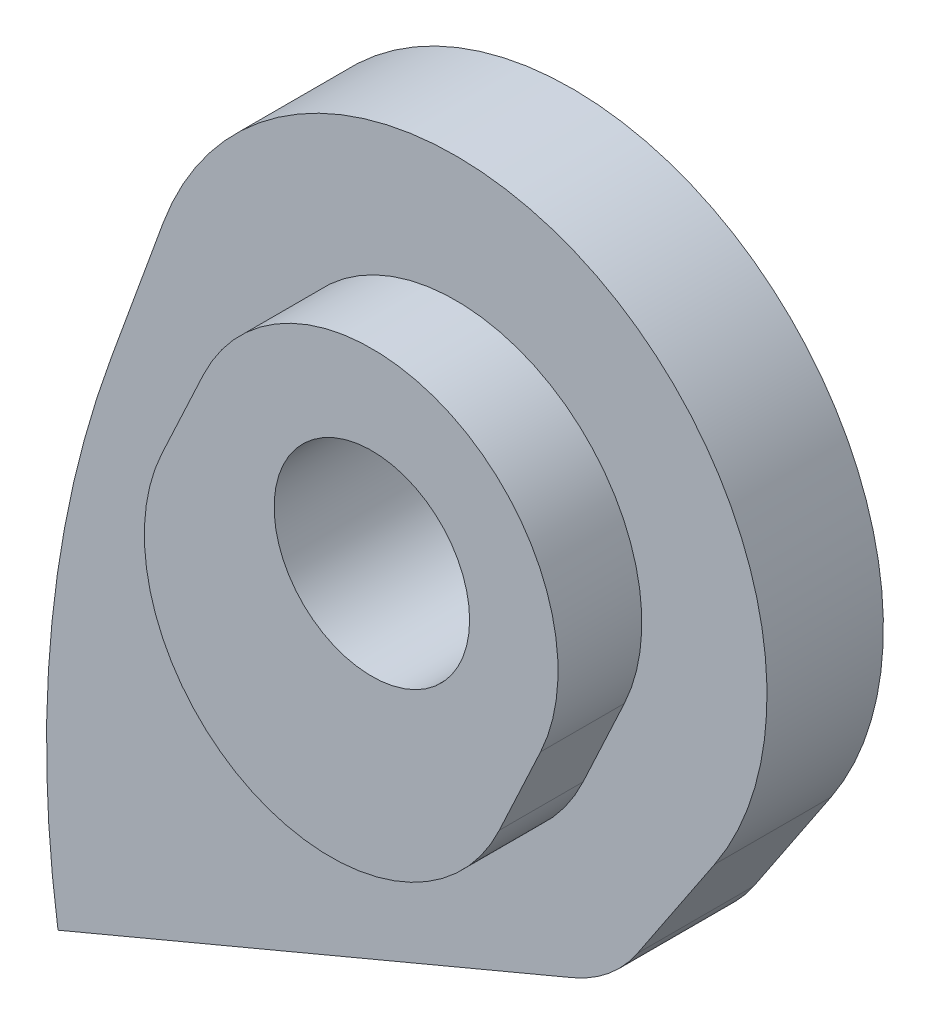
ISO-10303-21;
HEADER;
FILE_DESCRIPTION(('STEP AP214'),'2;1');
FILE_NAME('part.step','',(''),(''),'','','');
FILE_SCHEMA(('AUTOMOTIVE_DESIGN { 1 0 10303 214 1 1 1 1 }'));
ENDSEC;
DATA;
#1=APPLICATION_CONTEXT('core data for automotive mechanical design processes');
#2=APPLICATION_PROTOCOL_DEFINITION('international standard','automotive_design',2000,#1);
#3=PRODUCT_CONTEXT('',#1,'mechanical');
#4=PRODUCT('Part','Part','',(#3));
#5=PRODUCT_RELATED_PRODUCT_CATEGORY('part','',(#4));
#6=PRODUCT_DEFINITION_FORMATION('','',#4);
#7=PRODUCT_DEFINITION_CONTEXT('part definition',#1,'design');
#8=PRODUCT_DEFINITION('design','',#6,#7);
#9=PRODUCT_DEFINITION_SHAPE('','',#8);
#10=(LENGTH_UNIT() NAMED_UNIT(*) SI_UNIT(.MILLI.,.METRE.));
#11=(NAMED_UNIT(*) PLANE_ANGLE_UNIT() SI_UNIT($,.RADIAN.));
#12=(NAMED_UNIT(*) SI_UNIT($,.STERADIAN.) SOLID_ANGLE_UNIT());
#13=UNCERTAINTY_MEASURE_WITH_UNIT(LENGTH_MEASURE(1.E-05),#10,'distance_accuracy_value','');
#14=(GEOMETRIC_REPRESENTATION_CONTEXT(3) GLOBAL_UNCERTAINTY_ASSIGNED_CONTEXT((#13)) GLOBAL_UNIT_ASSIGNED_CONTEXT((#10,
#11,#12)) REPRESENTATION_CONTEXT('',''));
#15=CARTESIAN_POINT('',(0.,0.,0.));
#16=DIRECTION('',(0.,0.,1.));
#17=DIRECTION('',(1.,0.,0.));
#18=AXIS2_PLACEMENT_3D('',#15,#16,#17);
#19=CARTESIAN_POINT('',(0.11468761398859,80.1325343968941,0.));
#20=DIRECTION('',(0.,0.,1.));
#21=DIRECTION('',(1.,0.,0.));
#22=AXIS2_PLACEMENT_3D('',#19,#20,#21);
#23=PLANE('',#22);
#24=CARTESIAN_POINT('',(14.2795120747355,71.4970986035797,0.));
#25=DIRECTION('',(0.,0.,1.));
#26=DIRECTION('',(1.,0.,0.));
#27=AXIS2_PLACEMENT_3D('',#24,#25,#26);
#28=CIRCLE('',#27,22.9540740082007);
#29=CARTESIAN_POINT('',(-7.29026188774433,79.3478542857725,0.));
#30=VERTEX_POINT('',#29);
#31=CARTESIAN_POINT('',(-8.42769677737512,68.1396919078421,0.));
#32=VERTEX_POINT('',#31);
#33=EDGE_CURVE('E154',#30,#32,#28,.T.);
#34=ORIENTED_EDGE('',*,*,#33,.T.);
#35=DIRECTION('',(-0.921960246209325,-0.387284526426812,0.));
#36=VECTOR('',#35,1.);
#37=CARTESIAN_POINT('',(2.62584420432856,72.7829131335289,0.));
#38=LINE('',#37,#36);
#39=CARTESIAN_POINT('',(2.62584420432857,72.7829131335288,0.));
#40=VERTEX_POINT('',#39);
#41=EDGE_CURVE('E178',#40,#32,#38,.T.);
#42=ORIENTED_EDGE('',*,*,#41,.F.);
#43=CARTESIAN_POINT('',(1.41064938117233,75.6757767567832,0.));
#44=DIRECTION('',(0.,0.,-1.));
#45=DIRECTION('',(-1.,0.,0.));
#46=AXIS2_PLACEMENT_3D('',#43,#44,#45);
#47=CIRCLE('',#46,3.13773140994799);
#48=CARTESIAN_POINT('',(4.02035151590427,73.933705240183,0.));
#49=VERTEX_POINT('',#48);
#50=EDGE_CURVE('E173',#49,#40,#47,.T.);
#51=ORIENTED_EDGE('',*,*,#50,.F.);
#52=DIRECTION('',(0.555200968150768,0.831716228628761,0.));
#53=VECTOR('',#52,1.);
#54=CARTESIAN_POINT('',(4.02035151590429,73.933705240183,0.));
#55=LINE('',#54,#53);
#56=CARTESIAN_POINT('',(5.67886918351501,76.4182399199654,0.));
#57=VERTEX_POINT('',#56);
#58=EDGE_CURVE('E147',#49,#57,#55,.T.);
#59=ORIENTED_EDGE('',*,*,#58,.T.);
#60=CARTESIAN_POINT('',(0.11468761398859,80.1325343968941,0.));
#61=DIRECTION('',(0.,0.,1.));
#62=DIRECTION('',(1.,0.,0.));
#63=AXIS2_PLACEMENT_3D('',#60,#61,#62);
#64=CIRCLE('',#63,6.69000000000006);
#65=CARTESIAN_POINT('',(-6.17185601906935,82.4206491557424,0.));
#66=VERTEX_POINT('',#65);
#67=EDGE_CURVE('E149',#57,#66,#64,.T.);
#68=ORIENTED_EDGE('',*,*,#67,.T.);
#69=DIRECTION('',(-0.342020143325666,-0.939692620785909,0.));
#70=VECTOR('',#69,1.);
#71=CARTESIAN_POINT('',(-6.1718560190694,82.4206491557424,0.));
#72=LINE('',#71,#70);
#73=EDGE_CURVE('E155',#66,#30,#72,.T.);
#74=ORIENTED_EDGE('',*,*,#73,.T.);
#75=EDGE_LOOP('',(#34,#42,#51,#59,#68,#74));
#76=FACE_BOUND('',#75,.T.);
#77=DIRECTION('',(-0.4226182617407,-0.90630778703665,0.));
#78=VECTOR('',#77,1.);
#79=CARTESIAN_POINT('',(-3.51054353415801,81.8230074438569,0.));
#80=LINE('',#79,#78);
#81=CARTESIAN_POINT('',(-3.51054353415801,81.8230074438569,0.));
#82=VERTEX_POINT('',#81);
#83=CARTESIAN_POINT('',(-4.39804188381347,79.9197610910799,0.));
#84=VERTEX_POINT('',#83);
#85=EDGE_CURVE('E241',#82,#84,#80,.T.);
#86=ORIENTED_EDGE('',*,*,#85,.F.);
#87=CARTESIAN_POINT('',(0.114687613988609,80.1325343968941,0.));
#88=DIRECTION('',(0.,0.,1.));
#89=DIRECTION('',(1.,0.,0.));
#90=AXIS2_PLACEMENT_3D('',#87,#88,#89);
#91=CIRCLE('',#90,4.00000000000001);
#92=CARTESIAN_POINT('',(3.73991876213519,78.4420613499313,0.));
#93=VERTEX_POINT('',#92);
#94=EDGE_CURVE('E145',#93,#82,#91,.T.);
#95=ORIENTED_EDGE('',*,*,#94,.F.);
#96=DIRECTION('',(0.4226182617407,0.90630778703665,0.));
#97=VECTOR('',#96,1.);
#98=CARTESIAN_POINT('',(3.73991876213519,78.4420613499313,0.));
#99=LINE('',#98,#97);
#100=CARTESIAN_POINT('',(2.85242041247973,76.5388149971543,0.));
#101=VERTEX_POINT('',#100);
#102=EDGE_CURVE('E141',#101,#93,#99,.T.);
#103=ORIENTED_EDGE('',*,*,#102,.F.);
#104=CARTESIAN_POINT('',(-0.772810735666862,78.2292880441171,0.));
#105=DIRECTION('',(0.,0.,1.));
#106=DIRECTION('',(1.,0.,0.));
#107=AXIS2_PLACEMENT_3D('',#104,#105,#106);
#108=CIRCLE('',#107,4.00000000000001);
#109=EDGE_CURVE('E243',#84,#101,#108,.T.);
#110=ORIENTED_EDGE('',*,*,#109,.F.);
#111=EDGE_LOOP('',(#86,#95,#103,#110));
#112=FACE_BOUND('',#111,.T.);
#113=ADVANCED_FACE('F33',(#76,#112),#23,.T.);
#114=CARTESIAN_POINT('',(-8.01359795678153,76.9658058271043,-5.5));
#115=DIRECTION('',(-0.921960246209324,-0.387284526426815,0.));
#116=DIRECTION('',(0.387284526426815,-0.921960246209324,0.));
#117=AXIS2_PLACEMENT_3D('',#114,#115,#116);
#118=PLANE('',#117);
#119=DIRECTION('',(0.387284526426815,-0.921960246209324,0.));
#120=VECTOR('',#119,1.);
#121=CARTESIAN_POINT('',(-8.01359795678153,76.9658058271043,-2.5));
#122=LINE('',#121,#120);
#123=CARTESIAN_POINT('',(-8.01359795678153,76.9658058271043,-2.5));
#124=VERTEX_POINT('',#123);
#125=CARTESIAN_POINT('',(-4.92424784177968,69.611373108264,-2.5));
#126=VERTEX_POINT('',#125);
#127=EDGE_CURVE('E56',#124,#126,#122,.T.);
#128=ORIENTED_EDGE('',*,*,#127,.T.);
#129=DIRECTION('',(0.,0.,1.));
#130=VECTOR('',#129,1.);
#131=CARTESIAN_POINT('',(-4.92424784177968,69.611373108264,-5.5));
#132=LINE('',#131,#130);
#133=CARTESIAN_POINT('',(-4.92424784177968,69.611373108264,-5.5));
#134=VERTEX_POINT('',#133);
#135=EDGE_CURVE('E166',#134,#126,#132,.T.);
#136=ORIENTED_EDGE('',*,*,#135,.F.);
#137=DIRECTION('',(0.387284526426815,-0.921960246209324,0.));
#138=VECTOR('',#137,1.);
#139=CARTESIAN_POINT('',(-8.01359795678153,76.9658058271043,-5.5));
#140=LINE('',#139,#138);
#141=CARTESIAN_POINT('',(-8.01359795678153,76.9658058271043,-5.5));
#142=VERTEX_POINT('',#141);
#143=EDGE_CURVE('E164',#142,#134,#140,.T.);
#144=ORIENTED_EDGE('',*,*,#143,.F.);
#145=DIRECTION('',(0.,0.,1.));
#146=VECTOR('',#145,1.);
#147=CARTESIAN_POINT('',(-8.01359795678153,76.9658058271043,-5.5));
#148=LINE('',#147,#146);
#149=EDGE_CURVE('E170',#142,#124,#148,.T.);
#150=ORIENTED_EDGE('',*,*,#149,.T.);
#151=EDGE_LOOP('',(#128,#136,#144,#150));
#152=FACE_BOUND('',#151,.T.);
#153=ADVANCED_FACE('F230',(#152),#118,.F.);
#154=CARTESIAN_POINT('',(14.2795120747355,71.4970986035797,-5.5));
#155=DIRECTION('',(0.,0.,1.));
#156=DIRECTION('',(1.,0.,0.));
#157=AXIS2_PLACEMENT_3D('',#154,#155,#156);
#158=PLANE('',#157);
#159=DIRECTION('',(-0.921960246209326,-0.38728452642681,0.));
#160=VECTOR('',#159,1.);
#161=CARTESIAN_POINT('',(-4.92424784177968,69.611373108264,-5.5));
#162=LINE('',#161,#160);
#163=CARTESIAN_POINT('',(-8.42769677737511,68.1396919078421,-5.5));
#164=VERTEX_POINT('',#163);
#165=EDGE_CURVE('E159',#134,#164,#162,.T.);
#166=ORIENTED_EDGE('',*,*,#165,.T.);
#167=CARTESIAN_POINT('',(14.2795120747355,71.4970986035797,-5.5));
#168=DIRECTION('',(0.,0.,-1.));
#169=DIRECTION('',(1.,0.,0.));
#170=AXIS2_PLACEMENT_3D('',#167,#168,#169);
#171=CIRCLE('',#170,22.9540740082007);
#172=EDGE_CURVE('E162',#164,#142,#171,.T.);
#173=ORIENTED_EDGE('',*,*,#172,.T.);
#174=ORIENTED_EDGE('',*,*,#143,.T.);
#175=EDGE_LOOP('',(#166,#173,#174));
#176=FACE_BOUND('',#175,.T.);
#177=ADVANCED_FACE('F281',(#176),#158,.F.);
#178=CARTESIAN_POINT('',(0.11468761398859,80.1325343968941,-2.5));
#179=DIRECTION('',(0.,0.,1.));
#180=DIRECTION('',(1.,0.,0.));
#181=AXIS2_PLACEMENT_3D('',#178,#179,#180);
#182=PLANE('',#181);
#183=CARTESIAN_POINT('',(0.11468761398859,80.1325343968941,-2.5));
#184=DIRECTION('',(0.,0.,1.));
#185=DIRECTION('',(1.,0.,0.));
#186=AXIS2_PLACEMENT_3D('',#183,#184,#185);
#187=CIRCLE('',#186,2.10000000000001);
#188=CARTESIAN_POINT('',(2.2146876139886,80.1325343968941,-2.5));
#189=VERTEX_POINT('',#188);
#190=EDGE_CURVE('E246',#189,#189,#187,.T.);
#191=ORIENTED_EDGE('',*,*,#190,.T.);
#192=EDGE_LOOP('',(#191));
#193=FACE_BOUND('',#192,.T.);
#194=ORIENTED_EDGE('',*,*,#127,.F.);
#195=CARTESIAN_POINT('',(14.2795120747355,71.4970986035797,-2.5));
#196=DIRECTION('',(0.,0.,-1.));
#197=DIRECTION('',(-1.,0.,0.));
#198=AXIS2_PLACEMENT_3D('',#195,#196,#197);
#199=CIRCLE('',#198,22.9540740082007);
#200=CARTESIAN_POINT('',(-7.29026188774433,79.3478542857725,-2.5));
#201=VERTEX_POINT('',#200);
#202=EDGE_CURVE('E184',#124,#201,#199,.T.);
#203=ORIENTED_EDGE('',*,*,#202,.T.);
#204=DIRECTION('',(0.342020143325687,0.939692620785902,0.));
#205=VECTOR('',#204,1.);
#206=CARTESIAN_POINT('',(-6.17185601906934,82.4206491557424,-2.5));
#207=LINE('',#206,#205);
#208=CARTESIAN_POINT('',(-6.17185601906934,82.4206491557424,-2.5));
#209=VERTEX_POINT('',#208);
#210=EDGE_CURVE('E186',#201,#209,#207,.T.);
#211=ORIENTED_EDGE('',*,*,#210,.T.);
#212=CARTESIAN_POINT('',(0.11468761398859,80.1325343968941,-2.5));
#213=DIRECTION('',(0.,0.,-1.));
#214=DIRECTION('',(1.,0.,0.));
#215=AXIS2_PLACEMENT_3D('',#212,#213,#214);
#216=CIRCLE('',#215,6.69000000000002);
#217=CARTESIAN_POINT('',(5.67886918351501,76.4182399199654,-2.5));
#218=VERTEX_POINT('',#217);
#219=EDGE_CURVE('E174',#209,#218,#216,.T.);
#220=ORIENTED_EDGE('',*,*,#219,.T.);
#221=DIRECTION('',(-0.555200968150769,-0.83171622862876,0.));
#222=VECTOR('',#221,1.);
#223=CARTESIAN_POINT('',(5.67886918351501,76.4182399199654,-2.5));
#224=LINE('',#223,#222);
#225=CARTESIAN_POINT('',(4.02035151590429,73.933705240183,-2.5));
#226=VERTEX_POINT('',#225);
#227=EDGE_CURVE('E177',#218,#226,#224,.T.);
#228=ORIENTED_EDGE('',*,*,#227,.T.);
#229=CARTESIAN_POINT('',(1.41064938117233,75.6757767567832,-2.5));
#230=DIRECTION('',(0.,0.,-1.));
#231=DIRECTION('',(-1.,0.,0.));
#232=AXIS2_PLACEMENT_3D('',#229,#230,#231);
#233=CIRCLE('',#232,3.13773140994799);
#234=CARTESIAN_POINT('',(2.62584420432857,72.7829131335288,-2.5));
#235=VERTEX_POINT('',#234);
#236=EDGE_CURVE('E180',#226,#235,#233,.T.);
#237=ORIENTED_EDGE('',*,*,#236,.T.);
#238=DIRECTION('',(-0.921960246209325,-0.387284526426812,0.));
#239=VECTOR('',#238,1.);
#240=CARTESIAN_POINT('',(2.62584420432856,72.7829131335289,-2.5));
#241=LINE('',#240,#239);
#242=EDGE_CURVE('E182',#235,#126,#241,.T.);
#243=ORIENTED_EDGE('',*,*,#242,.T.);
#244=EDGE_LOOP('',(#194,#203,#211,#220,#228,#237,#243));
#245=FACE_BOUND('',#244,.T.);
#246=ADVANCED_FACE('F212',(#193,#245),#182,.F.);
#247=CARTESIAN_POINT('',(1.41064938117233,75.6757767567832,-2.5));
#248=DIRECTION('',(0.,0.,1.));
#249=DIRECTION('',(1.,0.,0.));
#250=AXIS2_PLACEMENT_3D('',#247,#248,#249);
#251=CYLINDRICAL_SURFACE('',#250,3.13773140994799);
#252=ORIENTED_EDGE('',*,*,#50,.T.);
#253=DIRECTION('',(0.,0.,1.));
#254=VECTOR('',#253,1.);
#255=CARTESIAN_POINT('',(2.62584420432857,72.7829131335288,-2.5));
#256=LINE('',#255,#254);
#257=EDGE_CURVE('E196',#235,#40,#256,.T.);
#258=ORIENTED_EDGE('',*,*,#257,.F.);
#259=ORIENTED_EDGE('',*,*,#236,.F.);
#260=DIRECTION('',(0.,0.,1.));
#261=VECTOR('',#260,1.);
#262=CARTESIAN_POINT('',(4.02035151590429,73.933705240183,-2.5));
#263=LINE('',#262,#261);
#264=EDGE_CURVE('E199',#226,#49,#263,.T.);
#265=ORIENTED_EDGE('',*,*,#264,.T.);
#266=EDGE_LOOP('',(#252,#258,#259,#265));
#267=FACE_BOUND('',#266,.T.);
#268=ADVANCED_FACE('F223',(#267),#251,.T.);
#269=CARTESIAN_POINT('',(2.62584420432856,72.7829131335289,-2.5));
#270=DIRECTION('',(-0.387284526426812,0.921960246209325,0.));
#271=DIRECTION('',(-0.921960246209325,-0.387284526426812,0.));
#272=AXIS2_PLACEMENT_3D('',#269,#270,#271);
#273=PLANE('',#272);
#274=ORIENTED_EDGE('',*,*,#41,.T.);
#275=DIRECTION('',(0.,0.,1.));
#276=VECTOR('',#275,1.);
#277=CARTESIAN_POINT('',(-8.42769677737511,68.1396919078421,-2.5));
#278=LINE('',#277,#276);
#279=EDGE_CURVE('E189',#164,#32,#278,.T.);
#280=ORIENTED_EDGE('',*,*,#279,.F.);
#281=ORIENTED_EDGE('',*,*,#165,.F.);
#282=ORIENTED_EDGE('',*,*,#135,.T.);
#283=ORIENTED_EDGE('',*,*,#242,.F.);
#284=ORIENTED_EDGE('',*,*,#257,.T.);
#285=EDGE_LOOP('',(#274,#280,#281,#282,#283,#284));
#286=FACE_BOUND('',#285,.T.);
#287=ADVANCED_FACE('F225',(#286),#273,.F.);
#288=CARTESIAN_POINT('',(14.2795120747355,71.4970986035797,11.));
#289=DIRECTION('',(0.,0.,-1.));
#290=DIRECTION('',(-1.,0.,0.));
#291=AXIS2_PLACEMENT_3D('',#288,#289,#290);
#292=CYLINDRICAL_SURFACE('',#291,22.9540740082007);
#293=ORIENTED_EDGE('',*,*,#33,.F.);
#294=DIRECTION('',(0.,0.,-1.));
#295=VECTOR('',#294,1.);
#296=CARTESIAN_POINT('',(-7.29026188774433,79.3478542857725,11.));
#297=LINE('',#296,#295);
#298=EDGE_CURVE('E202',#30,#201,#297,.T.);
#299=ORIENTED_EDGE('',*,*,#298,.T.);
#300=ORIENTED_EDGE('',*,*,#202,.F.);
#301=ORIENTED_EDGE('',*,*,#149,.F.);
#302=ORIENTED_EDGE('',*,*,#172,.F.);
#303=ORIENTED_EDGE('',*,*,#279,.T.);
#304=EDGE_LOOP('',(#293,#299,#300,#301,#302,#303));
#305=FACE_BOUND('',#304,.T.);
#306=ADVANCED_FACE('F235',(#305),#292,.T.);
#307=CARTESIAN_POINT('',(-6.1718560190694,82.4206491557424,11.));
#308=DIRECTION('',(0.939692620785909,-0.342020143325666,0.));
#309=DIRECTION('',(0.342020143325666,0.939692620785909,0.));
#310=AXIS2_PLACEMENT_3D('',#307,#308,#309);
#311=PLANE('',#310);
#312=ORIENTED_EDGE('',*,*,#73,.F.);
#313=DIRECTION('',(0.,0.,-1.));
#314=VECTOR('',#313,1.);
#315=CARTESIAN_POINT('',(-6.17185601906935,82.4206491557424,11.));
#316=LINE('',#315,#314);
#317=EDGE_CURVE('E41',#66,#209,#316,.T.);
#318=ORIENTED_EDGE('',*,*,#317,.T.);
#319=ORIENTED_EDGE('',*,*,#210,.F.);
#320=ORIENTED_EDGE('',*,*,#298,.F.);
#321=EDGE_LOOP('',(#312,#318,#319,#320));
#322=FACE_BOUND('',#321,.T.);
#323=ADVANCED_FACE('F207',(#322),#311,.F.);
#324=CARTESIAN_POINT('',(0.11468761398859,80.1325343968941,11.));
#325=DIRECTION('',(0.,0.,-1.));
#326=DIRECTION('',(-1.,0.,0.));
#327=AXIS2_PLACEMENT_3D('',#324,#325,#326);
#328=CYLINDRICAL_SURFACE('',#327,6.69000000000006);
#329=ORIENTED_EDGE('',*,*,#317,.F.);
#330=ORIENTED_EDGE('',*,*,#67,.F.);
#331=DIRECTION('',(0.,0.,-1.));
#332=VECTOR('',#331,1.);
#333=CARTESIAN_POINT('',(5.67886918351501,76.4182399199654,11.));
#334=LINE('',#333,#332);
#335=EDGE_CURVE('E11',#57,#218,#334,.T.);
#336=ORIENTED_EDGE('',*,*,#335,.T.);
#337=ORIENTED_EDGE('',*,*,#219,.F.);
#338=EDGE_LOOP('',(#329,#330,#336,#337));
#339=FACE_BOUND('',#338,.T.);
#340=ADVANCED_FACE('F213',(#339),#328,.T.);
#341=CARTESIAN_POINT('',(4.02035151590429,73.933705240183,11.));
#342=DIRECTION('',(-0.831716228628761,0.555200968150768,0.));
#343=DIRECTION('',(-0.555200968150768,-0.831716228628761,0.));
#344=AXIS2_PLACEMENT_3D('',#341,#342,#343);
#345=PLANE('',#344);
#346=ORIENTED_EDGE('',*,*,#58,.F.);
#347=ORIENTED_EDGE('',*,*,#264,.F.);
#348=ORIENTED_EDGE('',*,*,#227,.F.);
#349=ORIENTED_EDGE('',*,*,#335,.F.);
#350=EDGE_LOOP('',(#346,#347,#348,#349));
#351=FACE_BOUND('',#350,.T.);
#352=ADVANCED_FACE('F35',(#351),#345,.F.);
#353=CARTESIAN_POINT('',(0.114687613988609,80.1325343968941,1.8));
#354=DIRECTION('',(0.,0.,-1.));
#355=DIRECTION('',(-1.,0.,0.));
#356=AXIS2_PLACEMENT_3D('',#353,#354,#355);
#357=CYLINDRICAL_SURFACE('',#356,4.00000000000001);
#358=ORIENTED_EDGE('',*,*,#94,.T.);
#359=DIRECTION('',(0.,0.,-1.));
#360=VECTOR('',#359,1.);
#361=CARTESIAN_POINT('',(-3.51054353415801,81.8230074438569,1.8));
#362=LINE('',#361,#360);
#363=CARTESIAN_POINT('',(-3.51054353415801,81.8230074438569,1.8));
#364=VERTEX_POINT('',#363);
#365=EDGE_CURVE('E126',#364,#82,#362,.T.);
#366=ORIENTED_EDGE('',*,*,#365,.F.);
#367=CARTESIAN_POINT('',(0.114687613988609,80.1325343968941,1.8));
#368=DIRECTION('',(0.,0.,1.));
#369=DIRECTION('',(1.,0.,0.));
#370=AXIS2_PLACEMENT_3D('',#367,#368,#369);
#371=CIRCLE('',#370,4.00000000000001);
#372=CARTESIAN_POINT('',(3.73991876213519,78.4420613499313,1.8));
#373=VERTEX_POINT('',#372);
#374=EDGE_CURVE('E133',#373,#364,#371,.T.);
#375=ORIENTED_EDGE('',*,*,#374,.F.);
#376=DIRECTION('',(0.,0.,-1.));
#377=VECTOR('',#376,1.);
#378=CARTESIAN_POINT('',(3.73991876213519,78.4420613499313,1.8));
#379=LINE('',#378,#377);
#380=EDGE_CURVE('E251',#373,#93,#379,.T.);
#381=ORIENTED_EDGE('',*,*,#380,.T.);
#382=EDGE_LOOP('',(#358,#366,#375,#381));
#383=FACE_BOUND('',#382,.T.);
#384=ADVANCED_FACE('F143',(#383),#357,.T.);
#385=CARTESIAN_POINT('',(-3.51054353415801,81.8230074438569,1.8));
#386=DIRECTION('',(0.90630778703665,-0.4226182617407,0.));
#387=DIRECTION('',(0.4226182617407,0.90630778703665,0.));
#388=AXIS2_PLACEMENT_3D('',#385,#386,#387);
#389=PLANE('',#388);
#390=ORIENTED_EDGE('',*,*,#85,.T.);
#391=DIRECTION('',(0.,0.,-1.));
#392=VECTOR('',#391,1.);
#393=CARTESIAN_POINT('',(-4.39804188381347,79.9197610910799,1.8));
#394=LINE('',#393,#392);
#395=CARTESIAN_POINT('',(-4.39804188381347,79.9197610910799,1.8));
#396=VERTEX_POINT('',#395);
#397=EDGE_CURVE('E129',#396,#84,#394,.T.);
#398=ORIENTED_EDGE('',*,*,#397,.F.);
#399=DIRECTION('',(-0.4226182617407,-0.90630778703665,0.));
#400=VECTOR('',#399,1.);
#401=CARTESIAN_POINT('',(-3.51054353415801,81.8230074438569,1.8));
#402=LINE('',#401,#400);
#403=EDGE_CURVE('E122',#364,#396,#402,.T.);
#404=ORIENTED_EDGE('',*,*,#403,.F.);
#405=ORIENTED_EDGE('',*,*,#365,.T.);
#406=EDGE_LOOP('',(#390,#398,#404,#405));
#407=FACE_BOUND('',#406,.T.);
#408=ADVANCED_FACE('F124',(#407),#389,.F.);
#409=CARTESIAN_POINT('',(-0.772810735666862,78.2292880441171,1.8));
#410=DIRECTION('',(0.,0.,-1.));
#411=DIRECTION('',(-1.,0.,0.));
#412=AXIS2_PLACEMENT_3D('',#409,#410,#411);
#413=CYLINDRICAL_SURFACE('',#412,4.00000000000001);
#414=ORIENTED_EDGE('',*,*,#109,.T.);
#415=DIRECTION('',(0.,0.,-1.));
#416=VECTOR('',#415,1.);
#417=CARTESIAN_POINT('',(2.85242041247973,76.5388149971543,1.8));
#418=LINE('',#417,#416);
#419=CARTESIAN_POINT('',(2.85242041247973,76.5388149971543,1.8));
#420=VERTEX_POINT('',#419);
#421=EDGE_CURVE('E48',#420,#101,#418,.T.);
#422=ORIENTED_EDGE('',*,*,#421,.F.);
#423=CARTESIAN_POINT('',(-0.772810735666862,78.2292880441171,1.8));
#424=DIRECTION('',(0.,0.,1.));
#425=DIRECTION('',(1.,0.,0.));
#426=AXIS2_PLACEMENT_3D('',#423,#424,#425);
#427=CIRCLE('',#426,4.00000000000001);
#428=EDGE_CURVE('E132',#396,#420,#427,.T.);
#429=ORIENTED_EDGE('',*,*,#428,.F.);
#430=ORIENTED_EDGE('',*,*,#397,.T.);
#431=EDGE_LOOP('',(#414,#422,#429,#430));
#432=FACE_BOUND('',#431,.T.);
#433=ADVANCED_FACE('F271',(#432),#413,.T.);
#434=CARTESIAN_POINT('',(3.73991876213519,78.4420613499313,1.8));
#435=DIRECTION('',(-0.90630778703665,0.4226182617407,0.));
#436=DIRECTION('',(-0.4226182617407,-0.90630778703665,0.));
#437=AXIS2_PLACEMENT_3D('',#434,#435,#436);
#438=PLANE('',#437);
#439=ORIENTED_EDGE('',*,*,#102,.T.);
#440=ORIENTED_EDGE('',*,*,#380,.F.);
#441=DIRECTION('',(0.4226182617407,0.90630778703665,0.));
#442=VECTOR('',#441,1.);
#443=CARTESIAN_POINT('',(3.73991876213519,78.4420613499313,1.8));
#444=LINE('',#443,#442);
#445=EDGE_CURVE('E137',#420,#373,#444,.T.);
#446=ORIENTED_EDGE('',*,*,#445,.F.);
#447=ORIENTED_EDGE('',*,*,#421,.T.);
#448=EDGE_LOOP('',(#439,#440,#446,#447));
#449=FACE_BOUND('',#448,.T.);
#450=ADVANCED_FACE('F264',(#449),#438,.F.);
#451=CARTESIAN_POINT('',(0.114687613988609,80.1325343968941,1.8));
#452=DIRECTION('',(0.,0.,1.));
#453=DIRECTION('',(1.,0.,0.));
#454=AXIS2_PLACEMENT_3D('',#451,#452,#453);
#455=PLANE('',#454);
#456=CARTESIAN_POINT('',(0.11468761398859,80.1325343968941,1.8));
#457=DIRECTION('',(0.,0.,1.));
#458=DIRECTION('',(1.,0.,0.));
#459=AXIS2_PLACEMENT_3D('',#456,#457,#458);
#460=CIRCLE('',#459,2.10000000000001);
#461=CARTESIAN_POINT('',(2.2146876139886,80.1325343968941,1.8));
#462=VERTEX_POINT('',#461);
#463=EDGE_CURVE('E256',#462,#462,#460,.T.);
#464=ORIENTED_EDGE('',*,*,#463,.F.);
#465=EDGE_LOOP('',(#464));
#466=FACE_BOUND('',#465,.T.);
#467=ORIENTED_EDGE('',*,*,#374,.T.);
#468=ORIENTED_EDGE('',*,*,#403,.T.);
#469=ORIENTED_EDGE('',*,*,#428,.T.);
#470=ORIENTED_EDGE('',*,*,#445,.T.);
#471=EDGE_LOOP('',(#467,#468,#469,#470));
#472=FACE_BOUND('',#471,.T.);
#473=ADVANCED_FACE('F136',(#466,#472),#455,.T.);
#474=CARTESIAN_POINT('',(0.11468761398859,80.1325343968941,-5.5));
#475=DIRECTION('',(0.,0.,1.));
#476=DIRECTION('',(1.,0.,0.));
#477=AXIS2_PLACEMENT_3D('',#474,#475,#476);
#478=CYLINDRICAL_SURFACE('',#477,2.10000000000001);
#479=ORIENTED_EDGE('',*,*,#463,.T.);
#480=EDGE_LOOP('',(#479));
#481=FACE_BOUND('',#480,.T.);
#482=ORIENTED_EDGE('',*,*,#190,.F.);
#483=EDGE_LOOP('',(#482));
#484=FACE_BOUND('',#483,.T.);
#485=ADVANCED_FACE('F260',(#481,#484),#478,.F.);
#486=CLOSED_SHELL('',(#113,#153,#177,#246,#268,#287,#306,#323,#340,#352,#384,#408,#433,#450,
#473,#485));
#487=MANIFOLD_SOLID_BREP('B2',#486);
#488=ADVANCED_BREP_SHAPE_REPRESENTATION('',(#18,#487),#14);
#489=SHAPE_DEFINITION_REPRESENTATION(#9,#488);
ENDSEC;
END-ISO-10303-21;
